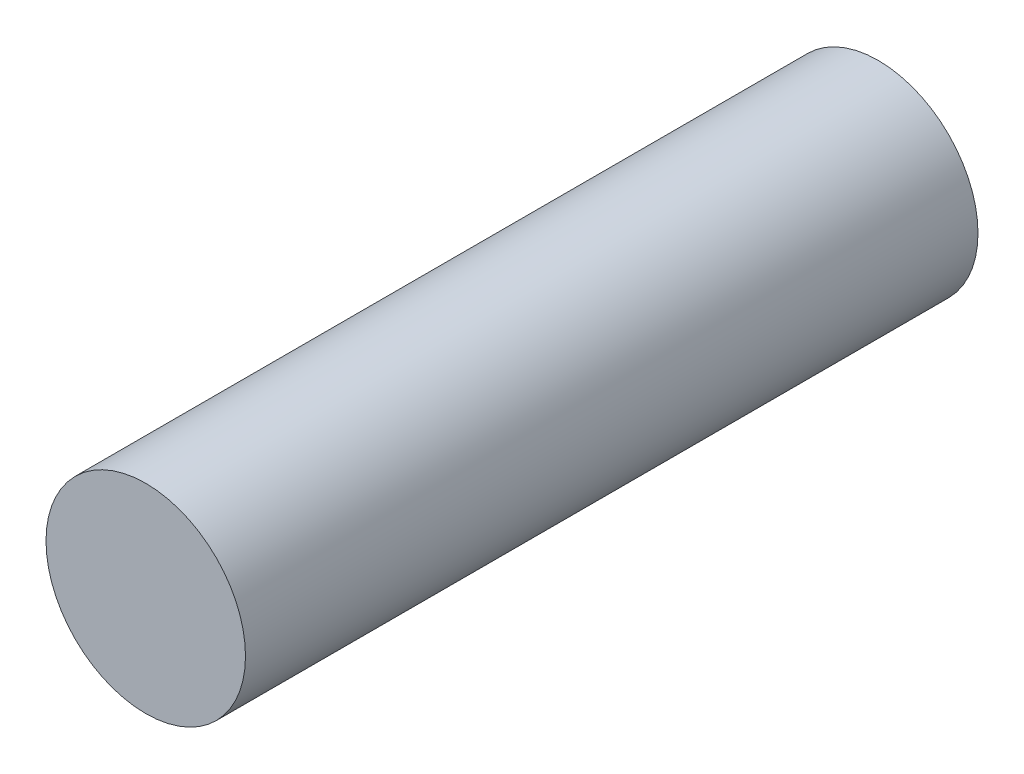
ISO-10303-21;
HEADER;
FILE_DESCRIPTION(('STEP AP214'),'2;1');
FILE_NAME('part.step','',(''),(''),'','','');
FILE_SCHEMA(('AUTOMOTIVE_DESIGN { 1 0 10303 214 1 1 1 1 }'));
ENDSEC;
DATA;
#1=APPLICATION_CONTEXT('core data for automotive mechanical design processes');
#2=APPLICATION_PROTOCOL_DEFINITION('international standard','automotive_design',2000,#1);
#3=PRODUCT_CONTEXT('',#1,'mechanical');
#4=PRODUCT('Part','Part','',(#3));
#5=PRODUCT_RELATED_PRODUCT_CATEGORY('part','',(#4));
#6=PRODUCT_DEFINITION_FORMATION('','',#4);
#7=PRODUCT_DEFINITION_CONTEXT('part definition',#1,'design');
#8=PRODUCT_DEFINITION('design','',#6,#7);
#9=PRODUCT_DEFINITION_SHAPE('','',#8);
#10=(LENGTH_UNIT() NAMED_UNIT(*) SI_UNIT(.MILLI.,.METRE.));
#11=(NAMED_UNIT(*) PLANE_ANGLE_UNIT() SI_UNIT($,.RADIAN.));
#12=(NAMED_UNIT(*) SI_UNIT($,.STERADIAN.) SOLID_ANGLE_UNIT());
#13=UNCERTAINTY_MEASURE_WITH_UNIT(LENGTH_MEASURE(1.E-05),#10,'distance_accuracy_value','');
#14=(GEOMETRIC_REPRESENTATION_CONTEXT(3) GLOBAL_UNCERTAINTY_ASSIGNED_CONTEXT((#13)) GLOBAL_UNIT_ASSIGNED_CONTEXT((#10,
#11,#12)) REPRESENTATION_CONTEXT('',''));
#15=CARTESIAN_POINT('',(0.,0.,0.));
#16=DIRECTION('',(0.,0.,1.));
#17=DIRECTION('',(1.,0.,0.));
#18=AXIS2_PLACEMENT_3D('',#15,#16,#17);
#19=CARTESIAN_POINT('',(0.,0.,35.25));
#20=DIRECTION('',(0.,0.,-1.));
#21=DIRECTION('',(-1.,0.,0.));
#22=AXIS2_PLACEMENT_3D('',#19,#20,#21);
#23=CYLINDRICAL_SURFACE('',#22,6.4);
#24=CARTESIAN_POINT('',(0.,0.,35.25));
#25=DIRECTION('',(0.,0.,1.));
#26=DIRECTION('',(1.,0.,0.));
#27=AXIS2_PLACEMENT_3D('',#24,#25,#26);
#28=CIRCLE('',#27,6.4);
#29=CARTESIAN_POINT('',(6.4,0.,35.25));
#30=VERTEX_POINT('',#29);
#31=EDGE_CURVE('E10',#30,#30,#28,.T.);
#32=ORIENTED_EDGE('',*,*,#31,.F.);
#33=EDGE_LOOP('',(#32));
#34=FACE_BOUND('',#33,.T.);
#35=CARTESIAN_POINT('',(0.,0.,-11.75));
#36=DIRECTION('',(0.,0.,1.));
#37=DIRECTION('',(1.,0.,0.));
#38=AXIS2_PLACEMENT_3D('',#35,#36,#37);
#39=CIRCLE('',#38,6.4);
#40=CARTESIAN_POINT('',(6.4,0.,-11.75));
#41=VERTEX_POINT('',#40);
#42=EDGE_CURVE('E36',#41,#41,#39,.T.);
#43=ORIENTED_EDGE('',*,*,#42,.T.);
#44=EDGE_LOOP('',(#43));
#45=FACE_BOUND('',#44,.T.);
#46=ADVANCED_FACE('F33',(#34,#45),#23,.T.);
#47=CARTESIAN_POINT('',(0.,0.,35.25));
#48=DIRECTION('',(0.,0.,1.));
#49=DIRECTION('',(1.,0.,0.));
#50=AXIS2_PLACEMENT_3D('',#47,#48,#49);
#51=PLANE('',#50);
#52=ORIENTED_EDGE('',*,*,#31,.T.);
#53=EDGE_LOOP('',(#52));
#54=FACE_BOUND('',#53,.T.);
#55=ADVANCED_FACE('F48',(#54),#51,.T.);
#56=CARTESIAN_POINT('',(0.,0.,-11.75));
#57=DIRECTION('',(0.,0.,1.));
#58=DIRECTION('',(1.,0.,0.));
#59=AXIS2_PLACEMENT_3D('',#56,#57,#58);
#60=PLANE('',#59);
#61=ORIENTED_EDGE('',*,*,#42,.F.);
#62=EDGE_LOOP('',(#61));
#63=FACE_BOUND('',#62,.T.);
#64=ADVANCED_FACE('F46',(#63),#60,.F.);
#65=CLOSED_SHELL('',(#46,#55,#64));
#66=MANIFOLD_SOLID_BREP('B2',#65);
#67=ADVANCED_BREP_SHAPE_REPRESENTATION('',(#18,#66),#14);
#68=SHAPE_DEFINITION_REPRESENTATION(#9,#67);
ENDSEC;
END-ISO-10303-21;
